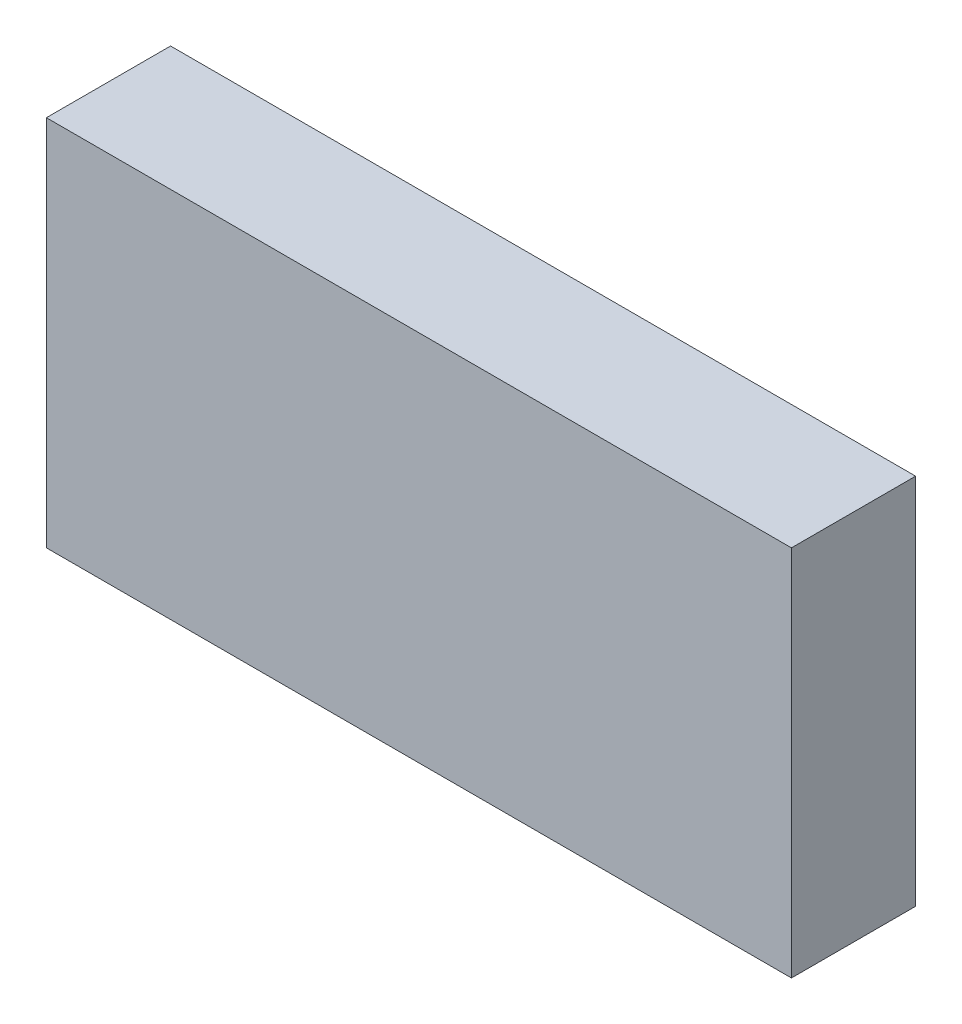
ISO-10303-21;
HEADER;
FILE_DESCRIPTION(('STEP AP214'),'2;1');
FILE_NAME('part.step','',(''),(''),'','','');
FILE_SCHEMA(('AUTOMOTIVE_DESIGN { 1 0 10303 214 1 1 1 1 }'));
ENDSEC;
DATA;
#1=APPLICATION_CONTEXT('core data for automotive mechanical design processes');
#2=APPLICATION_PROTOCOL_DEFINITION('international standard','automotive_design',2000,#1);
#3=PRODUCT_CONTEXT('',#1,'mechanical');
#4=PRODUCT('Part','Part','',(#3));
#5=PRODUCT_RELATED_PRODUCT_CATEGORY('part','',(#4));
#6=PRODUCT_DEFINITION_FORMATION('','',#4);
#7=PRODUCT_DEFINITION_CONTEXT('part definition',#1,'design');
#8=PRODUCT_DEFINITION('design','',#6,#7);
#9=PRODUCT_DEFINITION_SHAPE('','',#8);
#10=(LENGTH_UNIT() NAMED_UNIT(*) SI_UNIT(.MILLI.,.METRE.));
#11=(NAMED_UNIT(*) PLANE_ANGLE_UNIT() SI_UNIT($,.RADIAN.));
#12=(NAMED_UNIT(*) SI_UNIT($,.STERADIAN.) SOLID_ANGLE_UNIT());
#13=UNCERTAINTY_MEASURE_WITH_UNIT(LENGTH_MEASURE(1.E-05),#10,'distance_accuracy_value','');
#14=(GEOMETRIC_REPRESENTATION_CONTEXT(3) GLOBAL_UNCERTAINTY_ASSIGNED_CONTEXT((#13)) GLOBAL_UNIT_ASSIGNED_CONTEXT((#10,
#11,#12)) REPRESENTATION_CONTEXT('',''));
#15=CARTESIAN_POINT('',(0.,0.,0.));
#16=DIRECTION('',(0.,0.,1.));
#17=DIRECTION('',(1.,0.,0.));
#18=AXIS2_PLACEMENT_3D('',#15,#16,#17);
#19=CARTESIAN_POINT('',(60.,-30.,20.));
#20=DIRECTION('',(-1.,0.,0.));
#21=DIRECTION('',(0.,0.,1.));
#22=AXIS2_PLACEMENT_3D('',#19,#20,#21);
#23=PLANE('',#22);
#24=DIRECTION('',(0.,1.,0.));
#25=VECTOR('',#24,1.);
#26=CARTESIAN_POINT('',(60.,-30.,0.));
#27=LINE('',#26,#25);
#28=CARTESIAN_POINT('',(60.,-30.,0.));
#29=VERTEX_POINT('',#28);
#30=CARTESIAN_POINT('',(60.,30.,0.));
#31=VERTEX_POINT('',#30);
#32=EDGE_CURVE('E113',#29,#31,#27,.T.);
#33=ORIENTED_EDGE('',*,*,#32,.T.);
#34=DIRECTION('',(0.,0.,-1.));
#35=VECTOR('',#34,1.);
#36=CARTESIAN_POINT('',(60.,30.,20.));
#37=LINE('',#36,#35);
#38=CARTESIAN_POINT('',(60.,30.,20.));
#39=VERTEX_POINT('',#38);
#40=EDGE_CURVE('E11',#39,#31,#37,.T.);
#41=ORIENTED_EDGE('',*,*,#40,.F.);
#42=DIRECTION('',(0.,1.,0.));
#43=VECTOR('',#42,1.);
#44=CARTESIAN_POINT('',(60.,-30.,20.));
#45=LINE('',#44,#43);
#46=CARTESIAN_POINT('',(60.,-30.,20.));
#47=VERTEX_POINT('',#46);
#48=EDGE_CURVE('E97',#47,#39,#45,.T.);
#49=ORIENTED_EDGE('',*,*,#48,.F.);
#50=DIRECTION('',(0.,0.,-1.));
#51=VECTOR('',#50,1.);
#52=CARTESIAN_POINT('',(60.,-30.,20.));
#53=LINE('',#52,#51);
#54=EDGE_CURVE('E109',#47,#29,#53,.T.);
#55=ORIENTED_EDGE('',*,*,#54,.T.);
#56=EDGE_LOOP('',(#33,#41,#49,#55));
#57=FACE_BOUND('',#56,.T.);
#58=ADVANCED_FACE('F45',(#57),#23,.F.);
#59=CARTESIAN_POINT('',(-60.,30.,20.));
#60=DIRECTION('',(0.,-1.,0.));
#61=DIRECTION('',(0.,0.,-1.));
#62=AXIS2_PLACEMENT_3D('',#59,#60,#61);
#63=PLANE('',#62);
#64=DIRECTION('',(-1.,0.,0.));
#65=VECTOR('',#64,1.);
#66=CARTESIAN_POINT('',(-60.,30.,0.));
#67=LINE('',#66,#65);
#68=CARTESIAN_POINT('',(-60.,30.,0.));
#69=VERTEX_POINT('',#68);
#70=EDGE_CURVE('E102',#31,#69,#67,.T.);
#71=ORIENTED_EDGE('',*,*,#70,.T.);
#72=DIRECTION('',(0.,0.,-1.));
#73=VECTOR('',#72,1.);
#74=CARTESIAN_POINT('',(-60.,30.,20.));
#75=LINE('',#74,#73);
#76=CARTESIAN_POINT('',(-60.,30.,20.));
#77=VERTEX_POINT('',#76);
#78=EDGE_CURVE('E54',#77,#69,#75,.T.);
#79=ORIENTED_EDGE('',*,*,#78,.F.);
#80=DIRECTION('',(-1.,0.,0.));
#81=VECTOR('',#80,1.);
#82=CARTESIAN_POINT('',(-60.,30.,20.));
#83=LINE('',#82,#81);
#84=EDGE_CURVE('E92',#39,#77,#83,.T.);
#85=ORIENTED_EDGE('',*,*,#84,.F.);
#86=ORIENTED_EDGE('',*,*,#40,.T.);
#87=EDGE_LOOP('',(#71,#79,#85,#86));
#88=FACE_BOUND('',#87,.T.);
#89=ADVANCED_FACE('F101',(#88),#63,.F.);
#90=CARTESIAN_POINT('',(-60.,-30.,20.));
#91=DIRECTION('',(1.,0.,0.));
#92=DIRECTION('',(0.,0.,-1.));
#93=AXIS2_PLACEMENT_3D('',#90,#91,#92);
#94=PLANE('',#93);
#95=DIRECTION('',(0.,-1.,0.));
#96=VECTOR('',#95,1.);
#97=CARTESIAN_POINT('',(-60.,-30.,0.));
#98=LINE('',#97,#96);
#99=CARTESIAN_POINT('',(-60.,-30.,0.));
#100=VERTEX_POINT('',#99);
#101=EDGE_CURVE('E79',#69,#100,#98,.T.);
#102=ORIENTED_EDGE('',*,*,#101,.T.);
#103=DIRECTION('',(0.,0.,-1.));
#104=VECTOR('',#103,1.);
#105=CARTESIAN_POINT('',(-60.,-30.,20.));
#106=LINE('',#105,#104);
#107=CARTESIAN_POINT('',(-60.,-30.,20.));
#108=VERTEX_POINT('',#107);
#109=EDGE_CURVE('E104',#108,#100,#106,.T.);
#110=ORIENTED_EDGE('',*,*,#109,.F.);
#111=DIRECTION('',(0.,-1.,0.));
#112=VECTOR('',#111,1.);
#113=CARTESIAN_POINT('',(-60.,-30.,20.));
#114=LINE('',#113,#112);
#115=EDGE_CURVE('E95',#77,#108,#114,.T.);
#116=ORIENTED_EDGE('',*,*,#115,.F.);
#117=ORIENTED_EDGE('',*,*,#78,.T.);
#118=EDGE_LOOP('',(#102,#110,#116,#117));
#119=FACE_BOUND('',#118,.T.);
#120=ADVANCED_FACE('F105',(#119),#94,.F.);
#121=CARTESIAN_POINT('',(-60.,-30.,20.));
#122=DIRECTION('',(0.,1.,0.));
#123=DIRECTION('',(0.,0.,1.));
#124=AXIS2_PLACEMENT_3D('',#121,#122,#123);
#125=PLANE('',#124);
#126=DIRECTION('',(1.,0.,0.));
#127=VECTOR('',#126,1.);
#128=CARTESIAN_POINT('',(-60.,-30.,0.));
#129=LINE('',#128,#127);
#130=EDGE_CURVE('E85',#100,#29,#129,.T.);
#131=ORIENTED_EDGE('',*,*,#130,.T.);
#132=ORIENTED_EDGE('',*,*,#54,.F.);
#133=DIRECTION('',(1.,0.,0.));
#134=VECTOR('',#133,1.);
#135=CARTESIAN_POINT('',(-60.,-30.,20.));
#136=LINE('',#135,#134);
#137=EDGE_CURVE('E62',#108,#47,#136,.T.);
#138=ORIENTED_EDGE('',*,*,#137,.F.);
#139=ORIENTED_EDGE('',*,*,#109,.T.);
#140=EDGE_LOOP('',(#131,#132,#138,#139));
#141=FACE_BOUND('',#140,.T.);
#142=ADVANCED_FACE('F126',(#141),#125,.F.);
#143=CARTESIAN_POINT('',(0.,0.,20.));
#144=DIRECTION('',(0.,0.,-1.));
#145=DIRECTION('',(-1.,0.,0.));
#146=AXIS2_PLACEMENT_3D('',#143,#144,#145);
#147=PLANE('',#146);
#148=ORIENTED_EDGE('',*,*,#48,.T.);
#149=ORIENTED_EDGE('',*,*,#84,.T.);
#150=ORIENTED_EDGE('',*,*,#115,.T.);
#151=ORIENTED_EDGE('',*,*,#137,.T.);
#152=EDGE_LOOP('',(#148,#149,#150,#151));
#153=FACE_BOUND('',#152,.T.);
#154=ADVANCED_FACE('F93',(#153),#147,.F.);
#155=CARTESIAN_POINT('',(0.,0.,0.));
#156=DIRECTION('',(0.,0.,-1.));
#157=DIRECTION('',(-1.,0.,0.));
#158=AXIS2_PLACEMENT_3D('',#155,#156,#157);
#159=PLANE('',#158);
#160=ORIENTED_EDGE('',*,*,#32,.F.);
#161=ORIENTED_EDGE('',*,*,#130,.F.);
#162=ORIENTED_EDGE('',*,*,#101,.F.);
#163=ORIENTED_EDGE('',*,*,#70,.F.);
#164=EDGE_LOOP('',(#160,#161,#162,#163));
#165=FACE_BOUND('',#164,.T.);
#166=ADVANCED_FACE('F129',(#165),#159,.T.);
#167=CLOSED_SHELL('',(#58,#89,#120,#142,#154,#166));
#168=MANIFOLD_SOLID_BREP('B2',#167);
#169=ADVANCED_BREP_SHAPE_REPRESENTATION('',(#18,#168),#14);
#170=SHAPE_DEFINITION_REPRESENTATION(#9,#169);
ENDSEC;
END-ISO-10303-21;
